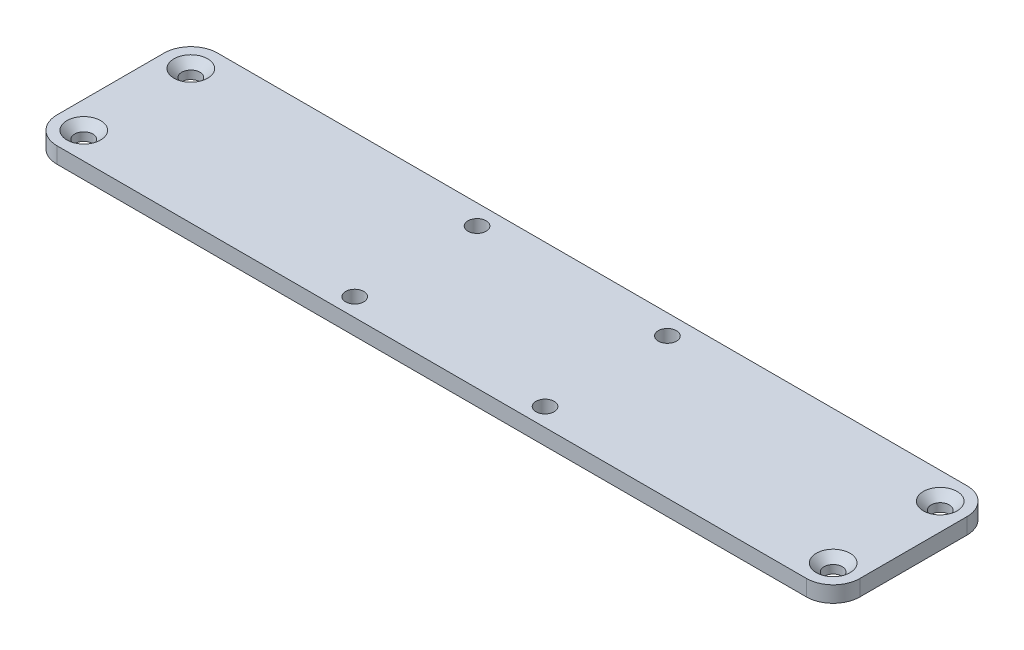
ISO-10303-21;
HEADER;
FILE_DESCRIPTION(('STEP AP214'),'2;1');
FILE_NAME('part.step','',(''),(''),'','','');
FILE_SCHEMA(('AUTOMOTIVE_DESIGN { 1 0 10303 214 1 1 1 1 }'));
ENDSEC;
DATA;
#1=APPLICATION_CONTEXT('core data for automotive mechanical design processes');
#2=APPLICATION_PROTOCOL_DEFINITION('international standard','automotive_design',2000,#1);
#3=PRODUCT_CONTEXT('',#1,'mechanical');
#4=PRODUCT('Part','Part','',(#3));
#5=PRODUCT_RELATED_PRODUCT_CATEGORY('part','',(#4));
#6=PRODUCT_DEFINITION_FORMATION('','',#4);
#7=PRODUCT_DEFINITION_CONTEXT('part definition',#1,'design');
#8=PRODUCT_DEFINITION('design','',#6,#7);
#9=PRODUCT_DEFINITION_SHAPE('','',#8);
#10=(LENGTH_UNIT() NAMED_UNIT(*) SI_UNIT(.MILLI.,.METRE.));
#11=(NAMED_UNIT(*) PLANE_ANGLE_UNIT() SI_UNIT($,.RADIAN.));
#12=(NAMED_UNIT(*) SI_UNIT($,.STERADIAN.) SOLID_ANGLE_UNIT());
#13=UNCERTAINTY_MEASURE_WITH_UNIT(LENGTH_MEASURE(1.E-05),#10,'distance_accuracy_value','');
#14=(GEOMETRIC_REPRESENTATION_CONTEXT(3) GLOBAL_UNCERTAINTY_ASSIGNED_CONTEXT((#13)) GLOBAL_UNIT_ASSIGNED_CONTEXT((#10,
#11,#12)) REPRESENTATION_CONTEXT('',''));
#15=CARTESIAN_POINT('',(0.,0.,0.));
#16=DIRECTION('',(0.,0.,1.));
#17=DIRECTION('',(1.,0.,0.));
#18=AXIS2_PLACEMENT_3D('',#15,#16,#17);
#19=CARTESIAN_POINT('',(-75.,3.,15.));
#20=DIRECTION('',(1.,0.,0.));
#21=DIRECTION('',(0.,0.,-1.));
#22=AXIS2_PLACEMENT_3D('',#19,#20,#21);
#23=PLANE('',#22);
#24=DIRECTION('',(0.,0.,1.));
#25=VECTOR('',#24,1.);
#26=CARTESIAN_POINT('',(-75.,3.,15.));
#27=LINE('',#26,#25);
#28=CARTESIAN_POINT('',(-75.,3.,-9.99999999999999));
#29=VERTEX_POINT('',#28);
#30=CARTESIAN_POINT('',(-75.,3.,10.));
#31=VERTEX_POINT('',#30);
#32=EDGE_CURVE('E133',#29,#31,#27,.T.);
#33=ORIENTED_EDGE('',*,*,#32,.F.);
#34=DIRECTION('',(0.,-1.,0.));
#35=VECTOR('',#34,1.);
#36=CARTESIAN_POINT('',(-75.,3.,-9.99999999999999));
#37=LINE('',#36,#35);
#38=CARTESIAN_POINT('',(-75.,0.,-9.99999999999999));
#39=VERTEX_POINT('',#38);
#40=EDGE_CURVE('E118',#29,#39,#37,.T.);
#41=ORIENTED_EDGE('',*,*,#40,.T.);
#42=DIRECTION('',(0.,0.,1.));
#43=VECTOR('',#42,1.);
#44=CARTESIAN_POINT('',(-75.,0.,15.));
#45=LINE('',#44,#43);
#46=CARTESIAN_POINT('',(-75.,0.,10.));
#47=VERTEX_POINT('',#46);
#48=EDGE_CURVE('E130',#39,#47,#45,.T.);
#49=ORIENTED_EDGE('',*,*,#48,.T.);
#50=DIRECTION('',(0.,-1.,0.));
#51=VECTOR('',#50,1.);
#52=CARTESIAN_POINT('',(-75.,3.,10.));
#53=LINE('',#52,#51);
#54=EDGE_CURVE('E135',#47,#31,#53,.F.);
#55=ORIENTED_EDGE('',*,*,#54,.T.);
#56=EDGE_LOOP('',(#33,#41,#49,#55));
#57=FACE_BOUND('',#56,.T.);
#58=ADVANCED_FACE('F48',(#57),#23,.F.);
#59=CARTESIAN_POINT('',(75.,3.,15.));
#60=DIRECTION('',(0.,0.,-1.));
#61=DIRECTION('',(-1.,0.,0.));
#62=AXIS2_PLACEMENT_3D('',#59,#60,#61);
#63=PLANE('',#62);
#64=DIRECTION('',(1.,0.,0.));
#65=VECTOR('',#64,1.);
#66=CARTESIAN_POINT('',(75.,0.,15.));
#67=LINE('',#66,#65);
#68=CARTESIAN_POINT('',(-70.,0.,15.));
#69=VERTEX_POINT('',#68);
#70=CARTESIAN_POINT('',(70.,0.,15.));
#71=VERTEX_POINT('',#70);
#72=EDGE_CURVE('E139',#69,#71,#67,.T.);
#73=ORIENTED_EDGE('',*,*,#72,.T.);
#74=DIRECTION('',(0.,-1.,0.));
#75=VECTOR('',#74,1.);
#76=CARTESIAN_POINT('',(70.,3.,15.));
#77=LINE('',#76,#75);
#78=CARTESIAN_POINT('',(70.,3.,15.));
#79=VERTEX_POINT('',#78);
#80=EDGE_CURVE('E13',#71,#79,#77,.F.);
#81=ORIENTED_EDGE('',*,*,#80,.T.);
#82=DIRECTION('',(1.,0.,0.));
#83=VECTOR('',#82,1.);
#84=CARTESIAN_POINT('',(75.,3.,15.));
#85=LINE('',#84,#83);
#86=CARTESIAN_POINT('',(-70.,3.,15.));
#87=VERTEX_POINT('',#86);
#88=EDGE_CURVE('E179',#87,#79,#85,.T.);
#89=ORIENTED_EDGE('',*,*,#88,.F.);
#90=DIRECTION('',(0.,-1.,0.));
#91=VECTOR('',#90,1.);
#92=CARTESIAN_POINT('',(-70.,3.,15.));
#93=LINE('',#92,#91);
#94=EDGE_CURVE('E56',#87,#69,#93,.T.);
#95=ORIENTED_EDGE('',*,*,#94,.T.);
#96=EDGE_LOOP('',(#73,#81,#89,#95));
#97=FACE_BOUND('',#96,.T.);
#98=ADVANCED_FACE('F177',(#97),#63,.F.);
#99=CARTESIAN_POINT('',(75.,3.,15.));
#100=DIRECTION('',(-1.,0.,0.));
#101=DIRECTION('',(0.,0.,1.));
#102=AXIS2_PLACEMENT_3D('',#99,#100,#101);
#103=PLANE('',#102);
#104=DIRECTION('',(0.,0.,-1.));
#105=VECTOR('',#104,1.);
#106=CARTESIAN_POINT('',(75.,0.,15.));
#107=LINE('',#106,#105);
#108=CARTESIAN_POINT('',(75.,0.,9.99999999999999));
#109=VERTEX_POINT('',#108);
#110=CARTESIAN_POINT('',(75.,0.,-10.));
#111=VERTEX_POINT('',#110);
#112=EDGE_CURVE('E143',#109,#111,#107,.T.);
#113=ORIENTED_EDGE('',*,*,#112,.T.);
#114=DIRECTION('',(0.,-1.,0.));
#115=VECTOR('',#114,1.);
#116=CARTESIAN_POINT('',(75.,3.,-10.));
#117=LINE('',#116,#115);
#118=CARTESIAN_POINT('',(75.,3.,-10.));
#119=VERTEX_POINT('',#118);
#120=EDGE_CURVE('E63',#111,#119,#117,.F.);
#121=ORIENTED_EDGE('',*,*,#120,.T.);
#122=DIRECTION('',(0.,0.,-1.));
#123=VECTOR('',#122,1.);
#124=CARTESIAN_POINT('',(75.,3.,15.));
#125=LINE('',#124,#123);
#126=CARTESIAN_POINT('',(75.,3.,9.99999999999999));
#127=VERTEX_POINT('',#126);
#128=EDGE_CURVE('E187',#127,#119,#125,.T.);
#129=ORIENTED_EDGE('',*,*,#128,.F.);
#130=DIRECTION('',(0.,-1.,0.));
#131=VECTOR('',#130,1.);
#132=CARTESIAN_POINT('',(75.,3.,9.99999999999999));
#133=LINE('',#132,#131);
#134=EDGE_CURVE('E170',#127,#109,#133,.T.);
#135=ORIENTED_EDGE('',*,*,#134,.T.);
#136=EDGE_LOOP('',(#113,#121,#129,#135));
#137=FACE_BOUND('',#136,.T.);
#138=ADVANCED_FACE('F186',(#137),#103,.F.);
#139=CARTESIAN_POINT('',(75.,3.,-15.));
#140=DIRECTION('',(0.,0.,1.));
#141=DIRECTION('',(1.,0.,0.));
#142=AXIS2_PLACEMENT_3D('',#139,#140,#141);
#143=PLANE('',#142);
#144=DIRECTION('',(-1.,0.,0.));
#145=VECTOR('',#144,1.);
#146=CARTESIAN_POINT('',(75.,0.,-15.));
#147=LINE('',#146,#145);
#148=CARTESIAN_POINT('',(70.,0.,-15.));
#149=VERTEX_POINT('',#148);
#150=CARTESIAN_POINT('',(-70.,0.,-15.));
#151=VERTEX_POINT('',#150);
#152=EDGE_CURVE('E153',#149,#151,#147,.T.);
#153=ORIENTED_EDGE('',*,*,#152,.T.);
#154=DIRECTION('',(0.,-1.,0.));
#155=VECTOR('',#154,1.);
#156=CARTESIAN_POINT('',(-70.,3.,-15.));
#157=LINE('',#156,#155);
#158=CARTESIAN_POINT('',(-70.,3.,-15.));
#159=VERTEX_POINT('',#158);
#160=EDGE_CURVE('E119',#151,#159,#157,.F.);
#161=ORIENTED_EDGE('',*,*,#160,.T.);
#162=DIRECTION('',(-1.,0.,0.));
#163=VECTOR('',#162,1.);
#164=CARTESIAN_POINT('',(75.,3.,-15.));
#165=LINE('',#164,#163);
#166=CARTESIAN_POINT('',(70.,3.,-15.));
#167=VERTEX_POINT('',#166);
#168=EDGE_CURVE('E149',#167,#159,#165,.T.);
#169=ORIENTED_EDGE('',*,*,#168,.F.);
#170=DIRECTION('',(0.,-1.,0.));
#171=VECTOR('',#170,1.);
#172=CARTESIAN_POINT('',(70.,3.,-15.));
#173=LINE('',#172,#171);
#174=EDGE_CURVE('E124',#167,#149,#173,.T.);
#175=ORIENTED_EDGE('',*,*,#174,.T.);
#176=EDGE_LOOP('',(#153,#161,#169,#175));
#177=FACE_BOUND('',#176,.T.);
#178=ADVANCED_FACE('F255',(#177),#143,.F.);
#179=CARTESIAN_POINT('',(0.,3.,0.));
#180=DIRECTION('',(0.,1.,0.));
#181=DIRECTION('',(0.,0.,1.));
#182=AXIS2_PLACEMENT_3D('',#179,#180,#181);
#183=PLANE('',#182);
#184=CARTESIAN_POINT('',(17.78,3.,11.6070481389039));
#185=DIRECTION('',(0.,1.,0.));
#186=DIRECTION('',(0.,0.,1.));
#187=AXIS2_PLACEMENT_3D('',#184,#185,#186);
#188=CIRCLE('',#187,1.69999999999999);
#189=CARTESIAN_POINT('',(17.78,3.,13.3070481389039));
#190=VERTEX_POINT('',#189);
#191=EDGE_CURVE('E246',#190,#190,#188,.T.);
#192=ORIENTED_EDGE('',*,*,#191,.F.);
#193=EDGE_LOOP('',(#192));
#194=FACE_BOUND('',#193,.T.);
#195=CARTESIAN_POINT('',(-17.78,3.,11.6070481389039));
#196=DIRECTION('',(0.,1.,0.));
#197=DIRECTION('',(0.,0.,1.));
#198=AXIS2_PLACEMENT_3D('',#195,#196,#197);
#199=CIRCLE('',#198,1.69999999999999);
#200=CARTESIAN_POINT('',(-17.78,3.,13.3070481389039));
#201=VERTEX_POINT('',#200);
#202=EDGE_CURVE('E240',#201,#201,#199,.T.);
#203=ORIENTED_EDGE('',*,*,#202,.F.);
#204=EDGE_LOOP('',(#203));
#205=FACE_BOUND('',#204,.T.);
#206=CARTESIAN_POINT('',(-17.78,3.,-11.2529518610961));
#207=DIRECTION('',(0.,1.,0.));
#208=DIRECTION('',(0.,0.,1.));
#209=AXIS2_PLACEMENT_3D('',#206,#207,#208);
#210=CIRCLE('',#209,1.69999999999999);
#211=CARTESIAN_POINT('',(-17.78,3.,-9.55295186109608));
#212=VERTEX_POINT('',#211);
#213=EDGE_CURVE('E234',#212,#212,#210,.T.);
#214=ORIENTED_EDGE('',*,*,#213,.F.);
#215=EDGE_LOOP('',(#214));
#216=FACE_BOUND('',#215,.T.);
#217=CARTESIAN_POINT('',(17.78,3.,-11.2529518610961));
#218=DIRECTION('',(0.,1.,0.));
#219=DIRECTION('',(0.,0.,1.));
#220=AXIS2_PLACEMENT_3D('',#217,#218,#219);
#221=CIRCLE('',#220,1.69999999999999);
#222=CARTESIAN_POINT('',(17.78,3.,-9.55295186109608));
#223=VERTEX_POINT('',#222);
#224=EDGE_CURVE('E228',#223,#223,#221,.T.);
#225=ORIENTED_EDGE('',*,*,#224,.F.);
#226=EDGE_LOOP('',(#225));
#227=FACE_BOUND('',#226,.T.);
#228=CARTESIAN_POINT('',(-70.,3.,-9.99999999999999));
#229=DIRECTION('',(0.,1.,0.));
#230=DIRECTION('',(0.,0.,1.));
#231=AXIS2_PLACEMENT_3D('',#228,#229,#230);
#232=CIRCLE('',#231,3.15);
#233=CARTESIAN_POINT('',(-70.,3.,-6.85));
#234=VERTEX_POINT('',#233);
#235=EDGE_CURVE('E222',#234,#234,#232,.T.);
#236=ORIENTED_EDGE('',*,*,#235,.F.);
#237=EDGE_LOOP('',(#236));
#238=FACE_BOUND('',#237,.T.);
#239=CARTESIAN_POINT('',(-70.,3.,9.99999999999998));
#240=DIRECTION('',(0.,1.,0.));
#241=DIRECTION('',(0.,0.,1.));
#242=AXIS2_PLACEMENT_3D('',#239,#240,#241);
#243=CIRCLE('',#242,3.15);
#244=CARTESIAN_POINT('',(-70.,3.,13.15));
#245=VERTEX_POINT('',#244);
#246=EDGE_CURVE('E213',#245,#245,#243,.T.);
#247=ORIENTED_EDGE('',*,*,#246,.F.);
#248=EDGE_LOOP('',(#247));
#249=FACE_BOUND('',#248,.T.);
#250=CARTESIAN_POINT('',(70.,3.,9.99999999999997));
#251=DIRECTION('',(0.,1.,0.));
#252=DIRECTION('',(0.,0.,1.));
#253=AXIS2_PLACEMENT_3D('',#250,#251,#252);
#254=CIRCLE('',#253,3.15);
#255=CARTESIAN_POINT('',(70.,3.,13.15));
#256=VERTEX_POINT('',#255);
#257=EDGE_CURVE('E204',#256,#256,#254,.T.);
#258=ORIENTED_EDGE('',*,*,#257,.F.);
#259=EDGE_LOOP('',(#258));
#260=FACE_BOUND('',#259,.T.);
#261=CARTESIAN_POINT('',(70.,3.,-9.99999999999998));
#262=DIRECTION('',(0.,1.,0.));
#263=DIRECTION('',(0.,0.,1.));
#264=AXIS2_PLACEMENT_3D('',#261,#262,#263);
#265=CIRCLE('',#264,3.15);
#266=CARTESIAN_POINT('',(70.,3.,-6.84999999999998));
#267=VERTEX_POINT('',#266);
#268=EDGE_CURVE('E195',#267,#267,#265,.T.);
#269=ORIENTED_EDGE('',*,*,#268,.F.);
#270=EDGE_LOOP('',(#269));
#271=FACE_BOUND('',#270,.T.);
#272=ORIENTED_EDGE('',*,*,#168,.T.);
#273=CARTESIAN_POINT('',(-70.,3.,-9.99999999999999));
#274=DIRECTION('',(0.,1.,0.));
#275=DIRECTION('',(0.,0.,1.));
#276=AXIS2_PLACEMENT_3D('',#273,#274,#275);
#277=CIRCLE('',#276,5.);
#278=EDGE_CURVE('E168',#159,#29,#277,.T.);
#279=ORIENTED_EDGE('',*,*,#278,.T.);
#280=ORIENTED_EDGE('',*,*,#32,.T.);
#281=CARTESIAN_POINT('',(-70.,3.,10.));
#282=DIRECTION('',(0.,1.,0.));
#283=DIRECTION('',(0.,0.,1.));
#284=AXIS2_PLACEMENT_3D('',#281,#282,#283);
#285=CIRCLE('',#284,5.);
#286=EDGE_CURVE('E163',#31,#87,#285,.T.);
#287=ORIENTED_EDGE('',*,*,#286,.T.);
#288=ORIENTED_EDGE('',*,*,#88,.T.);
#289=CARTESIAN_POINT('',(70.,3.,9.99999999999999));
#290=DIRECTION('',(0.,1.,0.));
#291=DIRECTION('',(0.,0.,1.));
#292=AXIS2_PLACEMENT_3D('',#289,#290,#291);
#293=CIRCLE('',#292,5.);
#294=EDGE_CURVE('E70',#79,#127,#293,.T.);
#295=ORIENTED_EDGE('',*,*,#294,.T.);
#296=ORIENTED_EDGE('',*,*,#128,.T.);
#297=CARTESIAN_POINT('',(70.,3.,-9.99999999999999));
#298=DIRECTION('',(0.,1.,0.));
#299=DIRECTION('',(0.,0.,1.));
#300=AXIS2_PLACEMENT_3D('',#297,#298,#299);
#301=CIRCLE('',#300,5.);
#302=EDGE_CURVE('E166',#119,#167,#301,.T.);
#303=ORIENTED_EDGE('',*,*,#302,.T.);
#304=EDGE_LOOP('',(#272,#279,#280,#287,#288,#295,#296,#303));
#305=FACE_BOUND('',#304,.T.);
#306=ADVANCED_FACE('F252',(#194,#205,#216,#227,#238,#249,#260,#271,#305),#183,.T.);
#307=CARTESIAN_POINT('',(0.,0.,0.));
#308=DIRECTION('',(0.,1.,0.));
#309=DIRECTION('',(0.,0.,1.));
#310=AXIS2_PLACEMENT_3D('',#307,#308,#309);
#311=PLANE('',#310);
#312=CARTESIAN_POINT('',(17.78,0.,11.6070481389039));
#313=DIRECTION('',(0.,1.,0.));
#314=DIRECTION('',(0.,0.,1.));
#315=AXIS2_PLACEMENT_3D('',#312,#313,#314);
#316=CIRCLE('',#315,1.7);
#317=CARTESIAN_POINT('',(17.78,0.,13.3070481389039));
#318=VERTEX_POINT('',#317);
#319=EDGE_CURVE('E243',#318,#318,#316,.T.);
#320=ORIENTED_EDGE('',*,*,#319,.T.);
#321=EDGE_LOOP('',(#320));
#322=FACE_BOUND('',#321,.T.);
#323=CARTESIAN_POINT('',(-17.78,0.,11.6070481389039));
#324=DIRECTION('',(0.,1.,0.));
#325=DIRECTION('',(0.,0.,1.));
#326=AXIS2_PLACEMENT_3D('',#323,#324,#325);
#327=CIRCLE('',#326,1.7);
#328=CARTESIAN_POINT('',(-17.78,0.,13.3070481389039));
#329=VERTEX_POINT('',#328);
#330=EDGE_CURVE('E237',#329,#329,#327,.T.);
#331=ORIENTED_EDGE('',*,*,#330,.T.);
#332=EDGE_LOOP('',(#331));
#333=FACE_BOUND('',#332,.T.);
#334=CARTESIAN_POINT('',(-17.78,0.,-11.2529518610961));
#335=DIRECTION('',(0.,1.,0.));
#336=DIRECTION('',(0.,0.,1.));
#337=AXIS2_PLACEMENT_3D('',#334,#335,#336);
#338=CIRCLE('',#337,1.7);
#339=CARTESIAN_POINT('',(-17.78,0.,-9.55295186109607));
#340=VERTEX_POINT('',#339);
#341=EDGE_CURVE('E231',#340,#340,#338,.T.);
#342=ORIENTED_EDGE('',*,*,#341,.T.);
#343=EDGE_LOOP('',(#342));
#344=FACE_BOUND('',#343,.T.);
#345=CARTESIAN_POINT('',(17.78,0.,-11.2529518610961));
#346=DIRECTION('',(0.,1.,0.));
#347=DIRECTION('',(0.,0.,1.));
#348=AXIS2_PLACEMENT_3D('',#345,#346,#347);
#349=CIRCLE('',#348,1.7);
#350=CARTESIAN_POINT('',(17.78,0.,-9.55295186109607));
#351=VERTEX_POINT('',#350);
#352=EDGE_CURVE('E225',#351,#351,#349,.T.);
#353=ORIENTED_EDGE('',*,*,#352,.T.);
#354=EDGE_LOOP('',(#353));
#355=FACE_BOUND('',#354,.T.);
#356=CARTESIAN_POINT('',(-70.,0.,-9.99999999999999));
#357=DIRECTION('',(0.,1.,0.));
#358=DIRECTION('',(0.,0.,1.));
#359=AXIS2_PLACEMENT_3D('',#356,#357,#358);
#360=CIRCLE('',#359,1.69999999999999);
#361=CARTESIAN_POINT('',(-70.,0.,-8.3));
#362=VERTEX_POINT('',#361);
#363=EDGE_CURVE('E216',#362,#362,#360,.T.);
#364=ORIENTED_EDGE('',*,*,#363,.T.);
#365=EDGE_LOOP('',(#364));
#366=FACE_BOUND('',#365,.T.);
#367=CARTESIAN_POINT('',(-70.,0.,9.99999999999998));
#368=DIRECTION('',(0.,1.,0.));
#369=DIRECTION('',(0.,0.,1.));
#370=AXIS2_PLACEMENT_3D('',#367,#368,#369);
#371=CIRCLE('',#370,1.69999999999999);
#372=CARTESIAN_POINT('',(-70.,0.,11.7));
#373=VERTEX_POINT('',#372);
#374=EDGE_CURVE('E207',#373,#373,#371,.T.);
#375=ORIENTED_EDGE('',*,*,#374,.T.);
#376=EDGE_LOOP('',(#375));
#377=FACE_BOUND('',#376,.T.);
#378=CARTESIAN_POINT('',(70.,0.,9.99999999999997));
#379=DIRECTION('',(0.,1.,0.));
#380=DIRECTION('',(0.,0.,1.));
#381=AXIS2_PLACEMENT_3D('',#378,#379,#380);
#382=CIRCLE('',#381,1.69999999999999);
#383=CARTESIAN_POINT('',(70.,0.,11.7));
#384=VERTEX_POINT('',#383);
#385=EDGE_CURVE('E198',#384,#384,#382,.T.);
#386=ORIENTED_EDGE('',*,*,#385,.T.);
#387=EDGE_LOOP('',(#386));
#388=FACE_BOUND('',#387,.T.);
#389=CARTESIAN_POINT('',(70.,0.,-9.99999999999998));
#390=DIRECTION('',(0.,1.,0.));
#391=DIRECTION('',(0.,0.,1.));
#392=AXIS2_PLACEMENT_3D('',#389,#390,#391);
#393=CIRCLE('',#392,1.69999999999999);
#394=CARTESIAN_POINT('',(70.,0.,-8.29999999999999));
#395=VERTEX_POINT('',#394);
#396=EDGE_CURVE('E140',#395,#395,#393,.T.);
#397=ORIENTED_EDGE('',*,*,#396,.T.);
#398=EDGE_LOOP('',(#397));
#399=FACE_BOUND('',#398,.T.);
#400=ORIENTED_EDGE('',*,*,#48,.F.);
#401=CARTESIAN_POINT('',(-70.,0.,-9.99999999999999));
#402=DIRECTION('',(0.,1.,0.));
#403=DIRECTION('',(0.,0.,1.));
#404=AXIS2_PLACEMENT_3D('',#401,#402,#403);
#405=CIRCLE('',#404,5.);
#406=EDGE_CURVE('E114',#39,#151,#405,.F.);
#407=ORIENTED_EDGE('',*,*,#406,.T.);
#408=ORIENTED_EDGE('',*,*,#152,.F.);
#409=CARTESIAN_POINT('',(70.,0.,-9.99999999999999));
#410=DIRECTION('',(0.,1.,0.));
#411=DIRECTION('',(0.,0.,1.));
#412=AXIS2_PLACEMENT_3D('',#409,#410,#411);
#413=CIRCLE('',#412,5.);
#414=EDGE_CURVE('E125',#149,#111,#413,.F.);
#415=ORIENTED_EDGE('',*,*,#414,.T.);
#416=ORIENTED_EDGE('',*,*,#112,.F.);
#417=CARTESIAN_POINT('',(70.,0.,9.99999999999999));
#418=DIRECTION('',(0.,1.,0.));
#419=DIRECTION('',(0.,0.,1.));
#420=AXIS2_PLACEMENT_3D('',#417,#418,#419);
#421=CIRCLE('',#420,5.);
#422=EDGE_CURVE('E157',#109,#71,#421,.F.);
#423=ORIENTED_EDGE('',*,*,#422,.T.);
#424=ORIENTED_EDGE('',*,*,#72,.F.);
#425=CARTESIAN_POINT('',(-70.,0.,10.));
#426=DIRECTION('',(0.,1.,0.));
#427=DIRECTION('',(0.,0.,1.));
#428=AXIS2_PLACEMENT_3D('',#425,#426,#427);
#429=CIRCLE('',#428,5.);
#430=EDGE_CURVE('E134',#69,#47,#429,.F.);
#431=ORIENTED_EDGE('',*,*,#430,.T.);
#432=EDGE_LOOP('',(#400,#407,#408,#415,#416,#423,#424,#431));
#433=FACE_BOUND('',#432,.T.);
#434=ADVANCED_FACE('F137',(#322,#333,#344,#355,#366,#377,#388,#399,#433),#311,.F.);
#435=CARTESIAN_POINT('',(70.,3.,-9.99999999999998));
#436=DIRECTION('',(0.,1.,0.));
#437=DIRECTION('',(0.,0.,1.));
#438=AXIS2_PLACEMENT_3D('',#435,#436,#437);
#439=CYLINDRICAL_SURFACE('',#438,1.69999999999999);
#440=ORIENTED_EDGE('',*,*,#396,.F.);
#441=EDGE_LOOP('',(#440));
#442=FACE_BOUND('',#441,.T.);
#443=CARTESIAN_POINT('',(70.,1.55,-9.99999999999998));
#444=DIRECTION('',(0.,1.,0.));
#445=DIRECTION('',(0.,0.,1.));
#446=AXIS2_PLACEMENT_3D('',#443,#444,#445);
#447=CIRCLE('',#446,1.69999999999999);
#448=CARTESIAN_POINT('',(70.,1.55,-8.29999999999999));
#449=VERTEX_POINT('',#448);
#450=EDGE_CURVE('E146',#449,#449,#447,.T.);
#451=ORIENTED_EDGE('',*,*,#450,.T.);
#452=EDGE_LOOP('',(#451));
#453=FACE_BOUND('',#452,.T.);
#454=ADVANCED_FACE('F295',(#442,#453),#439,.F.);
#455=CARTESIAN_POINT('',(70.,3.,-9.99999999999998));
#456=DIRECTION('',(0.,1.,0.));
#457=DIRECTION('',(0.,0.,1.));
#458=AXIS2_PLACEMENT_3D('',#455,#456,#457);
#459=CONICAL_SURFACE('',#458,3.15,0.785398163397449);
#460=ORIENTED_EDGE('',*,*,#450,.F.);
#461=EDGE_LOOP('',(#460));
#462=FACE_BOUND('',#461,.T.);
#463=ORIENTED_EDGE('',*,*,#268,.T.);
#464=EDGE_LOOP('',(#463));
#465=FACE_BOUND('',#464,.T.);
#466=ADVANCED_FACE('F300',(#462,#465),#459,.F.);
#467=CARTESIAN_POINT('',(70.,3.,9.99999999999997));
#468=DIRECTION('',(0.,1.,0.));
#469=DIRECTION('',(0.,0.,1.));
#470=AXIS2_PLACEMENT_3D('',#467,#468,#469);
#471=CYLINDRICAL_SURFACE('',#470,1.69999999999999);
#472=ORIENTED_EDGE('',*,*,#385,.F.);
#473=EDGE_LOOP('',(#472));
#474=FACE_BOUND('',#473,.T.);
#475=CARTESIAN_POINT('',(70.,1.55,9.99999999999997));
#476=DIRECTION('',(0.,1.,0.));
#477=DIRECTION('',(0.,0.,1.));
#478=AXIS2_PLACEMENT_3D('',#475,#476,#477);
#479=CIRCLE('',#478,1.69999999999999);
#480=CARTESIAN_POINT('',(70.,1.55,11.7));
#481=VERTEX_POINT('',#480);
#482=EDGE_CURVE('E201',#481,#481,#479,.T.);
#483=ORIENTED_EDGE('',*,*,#482,.T.);
#484=EDGE_LOOP('',(#483));
#485=FACE_BOUND('',#484,.T.);
#486=ADVANCED_FACE('F304',(#474,#485),#471,.F.);
#487=CARTESIAN_POINT('',(70.,3.,9.99999999999997));
#488=DIRECTION('',(0.,1.,0.));
#489=DIRECTION('',(0.,0.,1.));
#490=AXIS2_PLACEMENT_3D('',#487,#488,#489);
#491=CONICAL_SURFACE('',#490,3.15,0.785398163397449);
#492=ORIENTED_EDGE('',*,*,#482,.F.);
#493=EDGE_LOOP('',(#492));
#494=FACE_BOUND('',#493,.T.);
#495=ORIENTED_EDGE('',*,*,#257,.T.);
#496=EDGE_LOOP('',(#495));
#497=FACE_BOUND('',#496,.T.);
#498=ADVANCED_FACE('F308',(#494,#497),#491,.F.);
#499=CARTESIAN_POINT('',(-70.,3.,9.99999999999998));
#500=DIRECTION('',(0.,1.,0.));
#501=DIRECTION('',(0.,0.,1.));
#502=AXIS2_PLACEMENT_3D('',#499,#500,#501);
#503=CYLINDRICAL_SURFACE('',#502,1.69999999999999);
#504=ORIENTED_EDGE('',*,*,#374,.F.);
#505=EDGE_LOOP('',(#504));
#506=FACE_BOUND('',#505,.T.);
#507=CARTESIAN_POINT('',(-70.,1.55,9.99999999999998));
#508=DIRECTION('',(0.,1.,0.));
#509=DIRECTION('',(0.,0.,1.));
#510=AXIS2_PLACEMENT_3D('',#507,#508,#509);
#511=CIRCLE('',#510,1.69999999999999);
#512=CARTESIAN_POINT('',(-70.,1.55,11.7));
#513=VERTEX_POINT('',#512);
#514=EDGE_CURVE('E210',#513,#513,#511,.T.);
#515=ORIENTED_EDGE('',*,*,#514,.T.);
#516=EDGE_LOOP('',(#515));
#517=FACE_BOUND('',#516,.T.);
#518=ADVANCED_FACE('F312',(#506,#517),#503,.F.);
#519=CARTESIAN_POINT('',(-70.,3.,9.99999999999998));
#520=DIRECTION('',(0.,1.,0.));
#521=DIRECTION('',(0.,0.,1.));
#522=AXIS2_PLACEMENT_3D('',#519,#520,#521);
#523=CONICAL_SURFACE('',#522,3.15,0.785398163397449);
#524=ORIENTED_EDGE('',*,*,#514,.F.);
#525=EDGE_LOOP('',(#524));
#526=FACE_BOUND('',#525,.T.);
#527=ORIENTED_EDGE('',*,*,#246,.T.);
#528=EDGE_LOOP('',(#527));
#529=FACE_BOUND('',#528,.T.);
#530=ADVANCED_FACE('F316',(#526,#529),#523,.F.);
#531=CARTESIAN_POINT('',(-70.,3.,-9.99999999999999));
#532=DIRECTION('',(0.,1.,0.));
#533=DIRECTION('',(0.,0.,1.));
#534=AXIS2_PLACEMENT_3D('',#531,#532,#533);
#535=CYLINDRICAL_SURFACE('',#534,1.69999999999999);
#536=ORIENTED_EDGE('',*,*,#363,.F.);
#537=EDGE_LOOP('',(#536));
#538=FACE_BOUND('',#537,.T.);
#539=CARTESIAN_POINT('',(-70.,1.55,-9.99999999999999));
#540=DIRECTION('',(0.,1.,0.));
#541=DIRECTION('',(0.,0.,1.));
#542=AXIS2_PLACEMENT_3D('',#539,#540,#541);
#543=CIRCLE('',#542,1.69999999999999);
#544=CARTESIAN_POINT('',(-70.,1.55,-8.3));
#545=VERTEX_POINT('',#544);
#546=EDGE_CURVE('E219',#545,#545,#543,.T.);
#547=ORIENTED_EDGE('',*,*,#546,.T.);
#548=EDGE_LOOP('',(#547));
#549=FACE_BOUND('',#548,.T.);
#550=ADVANCED_FACE('F320',(#538,#549),#535,.F.);
#551=CARTESIAN_POINT('',(-70.,3.,-9.99999999999999));
#552=DIRECTION('',(0.,1.,0.));
#553=DIRECTION('',(0.,0.,1.));
#554=AXIS2_PLACEMENT_3D('',#551,#552,#553);
#555=CONICAL_SURFACE('',#554,3.15,0.785398163397449);
#556=ORIENTED_EDGE('',*,*,#546,.F.);
#557=EDGE_LOOP('',(#556));
#558=FACE_BOUND('',#557,.T.);
#559=ORIENTED_EDGE('',*,*,#235,.T.);
#560=EDGE_LOOP('',(#559));
#561=FACE_BOUND('',#560,.T.);
#562=ADVANCED_FACE('F281',(#558,#561),#555,.F.);
#563=CARTESIAN_POINT('',(-70.,3.,-9.99999999999999));
#564=DIRECTION('',(0.,-1.,0.));
#565=DIRECTION('',(0.,0.,-1.));
#566=AXIS2_PLACEMENT_3D('',#563,#564,#565);
#567=CYLINDRICAL_SURFACE('',#566,5.);
#568=ORIENTED_EDGE('',*,*,#278,.F.);
#569=ORIENTED_EDGE('',*,*,#160,.F.);
#570=ORIENTED_EDGE('',*,*,#406,.F.);
#571=ORIENTED_EDGE('',*,*,#40,.F.);
#572=EDGE_LOOP('',(#568,#569,#570,#571));
#573=FACE_BOUND('',#572,.T.);
#574=ADVANCED_FACE('F117',(#573),#567,.T.);
#575=CARTESIAN_POINT('',(70.,3.,-9.99999999999999));
#576=DIRECTION('',(0.,-1.,0.));
#577=DIRECTION('',(0.,0.,-1.));
#578=AXIS2_PLACEMENT_3D('',#575,#576,#577);
#579=CYLINDRICAL_SURFACE('',#578,5.);
#580=ORIENTED_EDGE('',*,*,#302,.F.);
#581=ORIENTED_EDGE('',*,*,#120,.F.);
#582=ORIENTED_EDGE('',*,*,#414,.F.);
#583=ORIENTED_EDGE('',*,*,#174,.F.);
#584=EDGE_LOOP('',(#580,#581,#582,#583));
#585=FACE_BOUND('',#584,.T.);
#586=ADVANCED_FACE('F274',(#585),#579,.T.);
#587=CARTESIAN_POINT('',(70.,3.,9.99999999999999));
#588=DIRECTION('',(0.,-1.,0.));
#589=DIRECTION('',(0.,0.,-1.));
#590=AXIS2_PLACEMENT_3D('',#587,#588,#589);
#591=CYLINDRICAL_SURFACE('',#590,5.);
#592=ORIENTED_EDGE('',*,*,#294,.F.);
#593=ORIENTED_EDGE('',*,*,#80,.F.);
#594=ORIENTED_EDGE('',*,*,#422,.F.);
#595=ORIENTED_EDGE('',*,*,#134,.F.);
#596=EDGE_LOOP('',(#592,#593,#594,#595));
#597=FACE_BOUND('',#596,.T.);
#598=ADVANCED_FACE('F185',(#597),#591,.T.);
#599=CARTESIAN_POINT('',(-70.,3.,10.));
#600=DIRECTION('',(0.,-1.,0.));
#601=DIRECTION('',(0.,0.,-1.));
#602=AXIS2_PLACEMENT_3D('',#599,#600,#601);
#603=CYLINDRICAL_SURFACE('',#602,5.);
#604=ORIENTED_EDGE('',*,*,#286,.F.);
#605=ORIENTED_EDGE('',*,*,#54,.F.);
#606=ORIENTED_EDGE('',*,*,#430,.F.);
#607=ORIENTED_EDGE('',*,*,#94,.F.);
#608=EDGE_LOOP('',(#604,#605,#606,#607));
#609=FACE_BOUND('',#608,.T.);
#610=ADVANCED_FACE('F50',(#609),#603,.T.);
#611=CARTESIAN_POINT('',(17.78,3.,-11.2529518610961));
#612=DIRECTION('',(0.,1.,0.));
#613=DIRECTION('',(0.,0.,1.));
#614=AXIS2_PLACEMENT_3D('',#611,#612,#613);
#615=CYLINDRICAL_SURFACE('',#614,1.69999999999999);
#616=ORIENTED_EDGE('',*,*,#352,.F.);
#617=EDGE_LOOP('',(#616));
#618=FACE_BOUND('',#617,.T.);
#619=ORIENTED_EDGE('',*,*,#224,.T.);
#620=EDGE_LOOP('',(#619));
#621=FACE_BOUND('',#620,.T.);
#622=ADVANCED_FACE('F328',(#618,#621),#615,.F.);
#623=CARTESIAN_POINT('',(-17.78,3.,-11.2529518610961));
#624=DIRECTION('',(0.,1.,0.));
#625=DIRECTION('',(0.,0.,1.));
#626=AXIS2_PLACEMENT_3D('',#623,#624,#625);
#627=CYLINDRICAL_SURFACE('',#626,1.69999999999999);
#628=ORIENTED_EDGE('',*,*,#341,.F.);
#629=EDGE_LOOP('',(#628));
#630=FACE_BOUND('',#629,.T.);
#631=ORIENTED_EDGE('',*,*,#213,.T.);
#632=EDGE_LOOP('',(#631));
#633=FACE_BOUND('',#632,.T.);
#634=ADVANCED_FACE('F331',(#630,#633),#627,.F.);
#635=CARTESIAN_POINT('',(-17.78,3.,11.6070481389039));
#636=DIRECTION('',(0.,1.,0.));
#637=DIRECTION('',(0.,0.,1.));
#638=AXIS2_PLACEMENT_3D('',#635,#636,#637);
#639=CYLINDRICAL_SURFACE('',#638,1.69999999999999);
#640=ORIENTED_EDGE('',*,*,#330,.F.);
#641=EDGE_LOOP('',(#640));
#642=FACE_BOUND('',#641,.T.);
#643=ORIENTED_EDGE('',*,*,#202,.T.);
#644=EDGE_LOOP('',(#643));
#645=FACE_BOUND('',#644,.T.);
#646=ADVANCED_FACE('F335',(#642,#645),#639,.F.);
#647=CARTESIAN_POINT('',(17.78,3.,11.6070481389039));
#648=DIRECTION('',(0.,1.,0.));
#649=DIRECTION('',(0.,0.,1.));
#650=AXIS2_PLACEMENT_3D('',#647,#648,#649);
#651=CYLINDRICAL_SURFACE('',#650,1.69999999999999);
#652=ORIENTED_EDGE('',*,*,#319,.F.);
#653=EDGE_LOOP('',(#652));
#654=FACE_BOUND('',#653,.T.);
#655=ORIENTED_EDGE('',*,*,#191,.T.);
#656=EDGE_LOOP('',(#655));
#657=FACE_BOUND('',#656,.T.);
#658=ADVANCED_FACE('F250',(#654,#657),#651,.F.);
#659=CLOSED_SHELL('',(#58,#98,#138,#178,#306,#434,#454,#466,#486,#498,#518,#530,#550,#562,#574,
#586,#598,#610,#622,#634,#646,#658));
#660=MANIFOLD_SOLID_BREP('B2',#659);
#661=ADVANCED_BREP_SHAPE_REPRESENTATION('',(#18,#660),#14);
#662=SHAPE_DEFINITION_REPRESENTATION(#9,#661);
ENDSEC;
END-ISO-10303-21;
